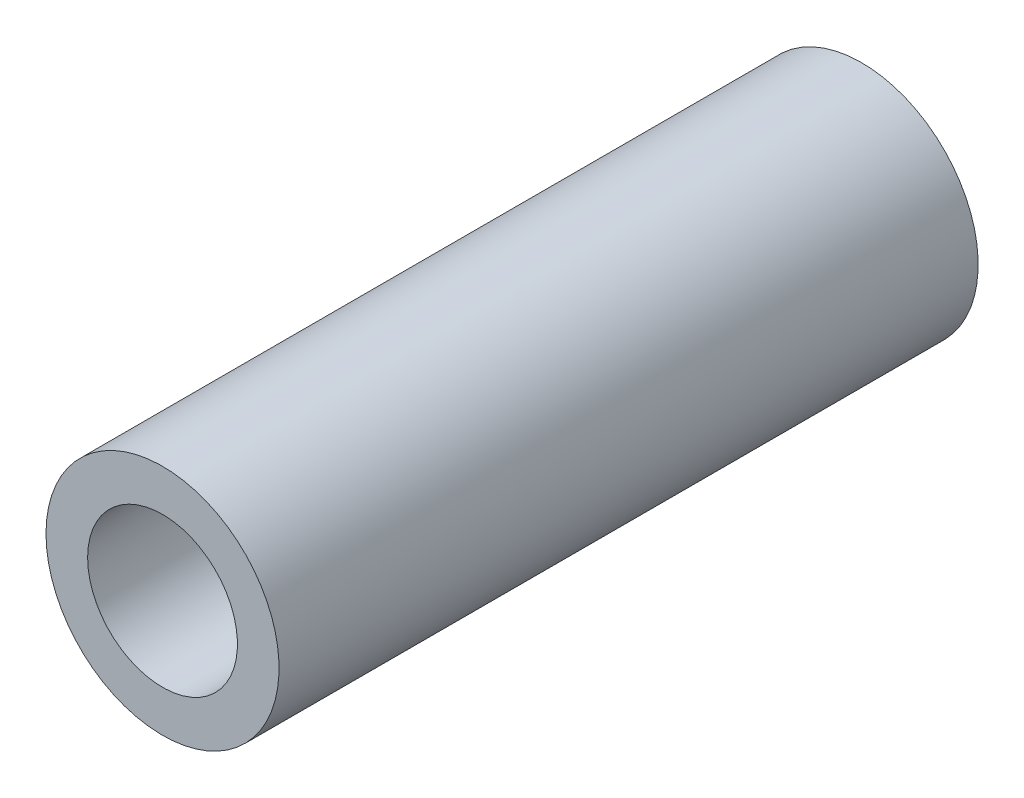
ISO-10303-21;
HEADER;
FILE_DESCRIPTION(('STEP AP214'),'2;1');
FILE_NAME('part.step','',(''),(''),'','','');
FILE_SCHEMA(('AUTOMOTIVE_DESIGN { 1 0 10303 214 1 1 1 1 }'));
ENDSEC;
DATA;
#1=APPLICATION_CONTEXT('core data for automotive mechanical design processes');
#2=APPLICATION_PROTOCOL_DEFINITION('international standard','automotive_design',2000,#1);
#3=PRODUCT_CONTEXT('',#1,'mechanical');
#4=PRODUCT('Part','Part','',(#3));
#5=PRODUCT_RELATED_PRODUCT_CATEGORY('part','',(#4));
#6=PRODUCT_DEFINITION_FORMATION('','',#4);
#7=PRODUCT_DEFINITION_CONTEXT('part definition',#1,'design');
#8=PRODUCT_DEFINITION('design','',#6,#7);
#9=PRODUCT_DEFINITION_SHAPE('','',#8);
#10=(LENGTH_UNIT() NAMED_UNIT(*) SI_UNIT(.MILLI.,.METRE.));
#11=(NAMED_UNIT(*) PLANE_ANGLE_UNIT() SI_UNIT($,.RADIAN.));
#12=(NAMED_UNIT(*) SI_UNIT($,.STERADIAN.) SOLID_ANGLE_UNIT());
#13=UNCERTAINTY_MEASURE_WITH_UNIT(LENGTH_MEASURE(1.E-05),#10,'distance_accuracy_value','');
#14=(GEOMETRIC_REPRESENTATION_CONTEXT(3) GLOBAL_UNCERTAINTY_ASSIGNED_CONTEXT((#13)) GLOBAL_UNIT_ASSIGNED_CONTEXT((#10,
#11,#12)) REPRESENTATION_CONTEXT('',''));
#15=CARTESIAN_POINT('',(0.,0.,0.));
#16=DIRECTION('',(0.,0.,1.));
#17=DIRECTION('',(1.,0.,0.));
#18=AXIS2_PLACEMENT_3D('',#15,#16,#17);
#19=CARTESIAN_POINT('',(0.,0.,21.));
#20=DIRECTION('',(0.,0.,1.));
#21=DIRECTION('',(1.,0.,0.));
#22=AXIS2_PLACEMENT_3D('',#19,#20,#21);
#23=PLANE('',#22);
#24=CARTESIAN_POINT('',(0.,0.,21.));
#25=DIRECTION('',(0.,0.,1.));
#26=DIRECTION('',(1.,0.,0.));
#27=AXIS2_PLACEMENT_3D('',#24,#25,#26);
#28=CIRCLE('',#27,3.5);
#29=CARTESIAN_POINT('',(-3.5,0.,21.));
#30=VERTEX_POINT('',#29);
#31=EDGE_CURVE('E10',#30,#30,#28,.T.);
#32=ORIENTED_EDGE('',*,*,#31,.T.);
#33=EDGE_LOOP('',(#32));
#34=FACE_BOUND('',#33,.T.);
#35=CARTESIAN_POINT('',(0.,0.,21.));
#36=DIRECTION('',(0.,0.,1.));
#37=DIRECTION('',(1.,0.,0.));
#38=AXIS2_PLACEMENT_3D('',#35,#36,#37);
#39=CIRCLE('',#38,2.25);
#40=CARTESIAN_POINT('',(-2.25,0.,21.));
#41=VERTEX_POINT('',#40);
#42=EDGE_CURVE('E43',#41,#41,#39,.T.);
#43=ORIENTED_EDGE('',*,*,#42,.F.);
#44=EDGE_LOOP('',(#43));
#45=FACE_BOUND('',#44,.T.);
#46=ADVANCED_FACE('F32',(#34,#45),#23,.T.);
#47=CARTESIAN_POINT('',(0.,0.,0.));
#48=DIRECTION('',(0.,0.,1.));
#49=DIRECTION('',(1.,0.,0.));
#50=AXIS2_PLACEMENT_3D('',#47,#48,#49);
#51=PLANE('',#50);
#52=CARTESIAN_POINT('',(0.,0.,0.));
#53=DIRECTION('',(0.,0.,1.));
#54=DIRECTION('',(1.,0.,0.));
#55=AXIS2_PLACEMENT_3D('',#52,#53,#54);
#56=CIRCLE('',#55,3.5);
#57=CARTESIAN_POINT('',(-3.5,0.,0.));
#58=VERTEX_POINT('',#57);
#59=EDGE_CURVE('E36',#58,#58,#56,.T.);
#60=ORIENTED_EDGE('',*,*,#59,.F.);
#61=EDGE_LOOP('',(#60));
#62=FACE_BOUND('',#61,.T.);
#63=CARTESIAN_POINT('',(0.,0.,0.));
#64=DIRECTION('',(0.,0.,1.));
#65=DIRECTION('',(1.,0.,0.));
#66=AXIS2_PLACEMENT_3D('',#63,#64,#65);
#67=CIRCLE('',#66,2.25);
#68=CARTESIAN_POINT('',(-2.25,0.,0.));
#69=VERTEX_POINT('',#68);
#70=EDGE_CURVE('E45',#69,#69,#67,.T.);
#71=ORIENTED_EDGE('',*,*,#70,.T.);
#72=EDGE_LOOP('',(#71));
#73=FACE_BOUND('',#72,.T.);
#74=ADVANCED_FACE('F55',(#62,#73),#51,.F.);
#75=CARTESIAN_POINT('',(0.,0.,21.));
#76=DIRECTION('',(0.,0.,-1.));
#77=DIRECTION('',(-1.,0.,0.));
#78=AXIS2_PLACEMENT_3D('',#75,#76,#77);
#79=CYLINDRICAL_SURFACE('',#78,3.5);
#80=CARTESIAN_POINT('',(-3.5,0.,21.));
#81=CARTESIAN_POINT('',(-3.5,0.,20.78125));
#82=CARTESIAN_POINT('',(-3.5,0.,20.5625));
#83=CARTESIAN_POINT('',(-3.5,0.,20.125));
#84=CARTESIAN_POINT('',(-3.5,0.,19.90625));
#85=CARTESIAN_POINT('',(-3.5,0.,19.46875));
#86=CARTESIAN_POINT('',(-3.5,0.,19.25));
#87=CARTESIAN_POINT('',(-3.5,0.,18.8125));
#88=CARTESIAN_POINT('',(-3.5,0.,18.59375));
#89=CARTESIAN_POINT('',(-3.5,0.,18.15625));
#90=CARTESIAN_POINT('',(-3.5,0.,17.9375));
#91=CARTESIAN_POINT('',(-3.5,0.,17.5));
#92=CARTESIAN_POINT('',(-3.5,0.,17.28125));
#93=CARTESIAN_POINT('',(-3.5,0.,16.84375));
#94=CARTESIAN_POINT('',(-3.5,0.,16.625));
#95=CARTESIAN_POINT('',(-3.5,0.,16.1875));
#96=CARTESIAN_POINT('',(-3.5,0.,15.96875));
#97=CARTESIAN_POINT('',(-3.5,0.,15.53125));
#98=CARTESIAN_POINT('',(-3.5,0.,15.3125));
#99=CARTESIAN_POINT('',(-3.5,0.,14.875));
#100=CARTESIAN_POINT('',(-3.5,0.,14.65625));
#101=CARTESIAN_POINT('',(-3.5,0.,14.21875));
#102=CARTESIAN_POINT('',(-3.5,0.,14.));
#103=CARTESIAN_POINT('',(-3.5,0.,13.5625));
#104=CARTESIAN_POINT('',(-3.5,0.,13.34375));
#105=CARTESIAN_POINT('',(-3.5,0.,12.90625));
#106=CARTESIAN_POINT('',(-3.5,0.,12.6875));
#107=CARTESIAN_POINT('',(-3.5,0.,12.25));
#108=CARTESIAN_POINT('',(-3.5,0.,12.03125));
#109=CARTESIAN_POINT('',(-3.5,0.,11.59375));
#110=CARTESIAN_POINT('',(-3.5,0.,11.375));
#111=CARTESIAN_POINT('',(-3.5,0.,10.9375));
#112=CARTESIAN_POINT('',(-3.5,0.,10.71875));
#113=CARTESIAN_POINT('',(-3.5,0.,10.28125));
#114=CARTESIAN_POINT('',(-3.5,0.,10.0625));
#115=CARTESIAN_POINT('',(-3.5,0.,9.625));
#116=CARTESIAN_POINT('',(-3.5,0.,9.40625));
#117=CARTESIAN_POINT('',(-3.5,0.,8.96875));
#118=CARTESIAN_POINT('',(-3.5,0.,8.75));
#119=CARTESIAN_POINT('',(-3.5,0.,8.3125));
#120=CARTESIAN_POINT('',(-3.5,0.,8.09375));
#121=CARTESIAN_POINT('',(-3.5,0.,7.65625));
#122=CARTESIAN_POINT('',(-3.5,0.,7.4375));
#123=CARTESIAN_POINT('',(-3.5,0.,7.));
#124=CARTESIAN_POINT('',(-3.5,0.,6.78125));
#125=CARTESIAN_POINT('',(-3.5,0.,6.34375));
#126=CARTESIAN_POINT('',(-3.5,0.,6.125));
#127=CARTESIAN_POINT('',(-3.5,0.,5.6875));
#128=CARTESIAN_POINT('',(-3.5,0.,5.46875));
#129=CARTESIAN_POINT('',(-3.5,0.,5.03125));
#130=CARTESIAN_POINT('',(-3.5,0.,4.8125));
#131=CARTESIAN_POINT('',(-3.5,0.,4.375));
#132=CARTESIAN_POINT('',(-3.5,0.,4.15625));
#133=CARTESIAN_POINT('',(-3.5,0.,3.71875));
#134=CARTESIAN_POINT('',(-3.5,0.,3.5));
#135=CARTESIAN_POINT('',(-3.5,0.,3.0625));
#136=CARTESIAN_POINT('',(-3.5,0.,2.84375));
#137=CARTESIAN_POINT('',(-3.5,0.,2.40625));
#138=CARTESIAN_POINT('',(-3.5,0.,2.1875));
#139=CARTESIAN_POINT('',(-3.5,0.,1.75));
#140=CARTESIAN_POINT('',(-3.5,0.,1.53125));
#141=CARTESIAN_POINT('',(-3.5,0.,1.09375));
#142=CARTESIAN_POINT('',(-3.5,0.,0.875000000000001));
#143=CARTESIAN_POINT('',(-3.5,0.,0.4375));
#144=CARTESIAN_POINT('',(-3.5,0.,0.21875));
#145=CARTESIAN_POINT('',(-3.5,0.,0.));
#146=B_SPLINE_CURVE_WITH_KNOTS('',3,(#80,#81,#82,#83,#84,#85,#86,#87,#88,#89,#90,#91,#92,#93,
#94,#95,#96,#97,#98,#99,#100,#101,#102,#103,#104,#105,#106,#107,#108,#109,#110,#111,#112,#113,
#114,#115,#116,#117,#118,#119,#120,#121,#122,#123,#124,#125,#126,#127,#128,#129,#130,#131,#132,
#133,#134,#135,#136,#137,#138,#139,#140,#141,#142,#143,#144,#145),.UNSPECIFIED.,.F.,.F.,(4,2,2,
2,2,2,2,2,2,2,2,2,2,2,2,2,2,2,2,2,2,2,2,2,2,2,2,2,2,2,2,2,4),(0.,0.656249999999997,1.3125,
1.96875,2.625,3.28125,3.9375,4.59375,5.25,5.90625,6.5625,7.21875,7.875,8.53125,9.1875,9.84375,
10.5,11.15625,11.8125,12.46875,13.125,13.78125,14.4375,15.09375,15.75,16.40625,17.0625,17.71875,
18.375,19.03125,19.6875,20.34375,21.),.UNSPECIFIED.);
#147=EDGE_CURVE('BSEAM34',#30,#58,#146,.T.);
#148=ORIENTED_EDGE('',*,*,#31,.F.);
#149=ORIENTED_EDGE('',*,*,#59,.T.);
#150=ORIENTED_EDGE('',*,*,#147,.T.);
#151=ORIENTED_EDGE('',*,*,#147,.F.);
#152=EDGE_LOOP('',(#148,#150,#149,#151));
#153=FACE_BOUND('',#152,.T.);
#154=ADVANCED_FACE('F34',(#153),#79,.T.);
#155=CARTESIAN_POINT('',(0.,0.,21.));
#156=DIRECTION('',(0.,0.,-1.));
#157=DIRECTION('',(-1.,0.,0.));
#158=AXIS2_PLACEMENT_3D('',#155,#156,#157);
#159=CYLINDRICAL_SURFACE('',#158,2.25);
#160=CARTESIAN_POINT('',(-2.25,0.,21.));
#161=CARTESIAN_POINT('',(-2.25,0.,20.78125));
#162=CARTESIAN_POINT('',(-2.25,0.,20.5625));
#163=CARTESIAN_POINT('',(-2.25,0.,20.125));
#164=CARTESIAN_POINT('',(-2.25,0.,19.90625));
#165=CARTESIAN_POINT('',(-2.25,0.,19.46875));
#166=CARTESIAN_POINT('',(-2.25,0.,19.25));
#167=CARTESIAN_POINT('',(-2.25,0.,18.8125));
#168=CARTESIAN_POINT('',(-2.25,0.,18.59375));
#169=CARTESIAN_POINT('',(-2.25,0.,18.15625));
#170=CARTESIAN_POINT('',(-2.25,0.,17.9375));
#171=CARTESIAN_POINT('',(-2.25,0.,17.5));
#172=CARTESIAN_POINT('',(-2.25,0.,17.28125));
#173=CARTESIAN_POINT('',(-2.25,0.,16.84375));
#174=CARTESIAN_POINT('',(-2.25,0.,16.625));
#175=CARTESIAN_POINT('',(-2.25,0.,16.1875));
#176=CARTESIAN_POINT('',(-2.25,0.,15.96875));
#177=CARTESIAN_POINT('',(-2.25,0.,15.53125));
#178=CARTESIAN_POINT('',(-2.25,0.,15.3125));
#179=CARTESIAN_POINT('',(-2.25,0.,14.875));
#180=CARTESIAN_POINT('',(-2.25,0.,14.65625));
#181=CARTESIAN_POINT('',(-2.25,0.,14.21875));
#182=CARTESIAN_POINT('',(-2.25,0.,14.));
#183=CARTESIAN_POINT('',(-2.25,0.,13.5625));
#184=CARTESIAN_POINT('',(-2.25,0.,13.34375));
#185=CARTESIAN_POINT('',(-2.25,0.,12.90625));
#186=CARTESIAN_POINT('',(-2.25,0.,12.6875));
#187=CARTESIAN_POINT('',(-2.25,0.,12.25));
#188=CARTESIAN_POINT('',(-2.25,0.,12.03125));
#189=CARTESIAN_POINT('',(-2.25,0.,11.59375));
#190=CARTESIAN_POINT('',(-2.25,0.,11.375));
#191=CARTESIAN_POINT('',(-2.25,0.,10.9375));
#192=CARTESIAN_POINT('',(-2.25,0.,10.71875));
#193=CARTESIAN_POINT('',(-2.25,0.,10.28125));
#194=CARTESIAN_POINT('',(-2.25,0.,10.0625));
#195=CARTESIAN_POINT('',(-2.25,0.,9.625));
#196=CARTESIAN_POINT('',(-2.25,0.,9.40625));
#197=CARTESIAN_POINT('',(-2.25,0.,8.96875));
#198=CARTESIAN_POINT('',(-2.25,0.,8.75));
#199=CARTESIAN_POINT('',(-2.25,0.,8.3125));
#200=CARTESIAN_POINT('',(-2.25,0.,8.09375));
#201=CARTESIAN_POINT('',(-2.25,0.,7.65625));
#202=CARTESIAN_POINT('',(-2.25,0.,7.4375));
#203=CARTESIAN_POINT('',(-2.25,0.,7.));
#204=CARTESIAN_POINT('',(-2.25,0.,6.78125));
#205=CARTESIAN_POINT('',(-2.25,0.,6.34375));
#206=CARTESIAN_POINT('',(-2.25,0.,6.125));
#207=CARTESIAN_POINT('',(-2.25,0.,5.6875));
#208=CARTESIAN_POINT('',(-2.25,0.,5.46875));
#209=CARTESIAN_POINT('',(-2.25,0.,5.03125));
#210=CARTESIAN_POINT('',(-2.25,0.,4.8125));
#211=CARTESIAN_POINT('',(-2.25,0.,4.375));
#212=CARTESIAN_POINT('',(-2.25,0.,4.15625));
#213=CARTESIAN_POINT('',(-2.25,0.,3.71875));
#214=CARTESIAN_POINT('',(-2.25,0.,3.5));
#215=CARTESIAN_POINT('',(-2.25,0.,3.0625));
#216=CARTESIAN_POINT('',(-2.25,0.,2.84375));
#217=CARTESIAN_POINT('',(-2.25,0.,2.40625));
#218=CARTESIAN_POINT('',(-2.25,0.,2.1875));
#219=CARTESIAN_POINT('',(-2.25,0.,1.75));
#220=CARTESIAN_POINT('',(-2.25,0.,1.53125));
#221=CARTESIAN_POINT('',(-2.25,0.,1.09375));
#222=CARTESIAN_POINT('',(-2.25,0.,0.875000000000001));
#223=CARTESIAN_POINT('',(-2.25,0.,0.4375));
#224=CARTESIAN_POINT('',(-2.25,0.,0.21875));
#225=CARTESIAN_POINT('',(-2.25,0.,0.));
#226=B_SPLINE_CURVE_WITH_KNOTS('',3,(#160,#161,#162,#163,#164,#165,#166,#167,#168,#169,#170,
#171,#172,#173,#174,#175,#176,#177,#178,#179,#180,#181,#182,#183,#184,#185,#186,#187,#188,#189,
#190,#191,#192,#193,#194,#195,#196,#197,#198,#199,#200,#201,#202,#203,#204,#205,#206,#207,#208,
#209,#210,#211,#212,#213,#214,#215,#216,#217,#218,#219,#220,#221,#222,#223,#224,#225),
.UNSPECIFIED.,.F.,.F.,(4,2,2,2,2,2,2,2,2,2,2,2,2,2,2,2,2,2,2,2,2,2,2,2,2,2,2,2,2,2,2,2,4),(0.,
0.656249999999997,1.3125,1.96875,2.625,3.28125,3.9375,4.59375,5.25,5.90625,6.5625,7.21875,7.875,
8.53125,9.1875,9.84375,10.5,11.15625,11.8125,12.46875,13.125,13.78125,14.4375,15.09375,15.75,
16.40625,17.0625,17.71875,18.375,19.03125,19.6875,20.34375,21.),.UNSPECIFIED.);
#227=EDGE_CURVE('BSEAM51',#41,#69,#226,.T.);
#228=ORIENTED_EDGE('',*,*,#42,.T.);
#229=ORIENTED_EDGE('',*,*,#70,.F.);
#230=ORIENTED_EDGE('',*,*,#227,.T.);
#231=ORIENTED_EDGE('',*,*,#227,.F.);
#232=EDGE_LOOP('',(#228,#230,#229,#231));
#233=FACE_BOUND('',#232,.T.);
#234=ADVANCED_FACE('F51',(#233),#159,.F.);
#235=CLOSED_SHELL('',(#46,#74,#154,#234));
#236=MANIFOLD_SOLID_BREP('B2',#235);
#237=ADVANCED_BREP_SHAPE_REPRESENTATION('',(#18,#236),#14);
#238=SHAPE_DEFINITION_REPRESENTATION(#9,#237);
ENDSEC;
END-ISO-10303-21;
